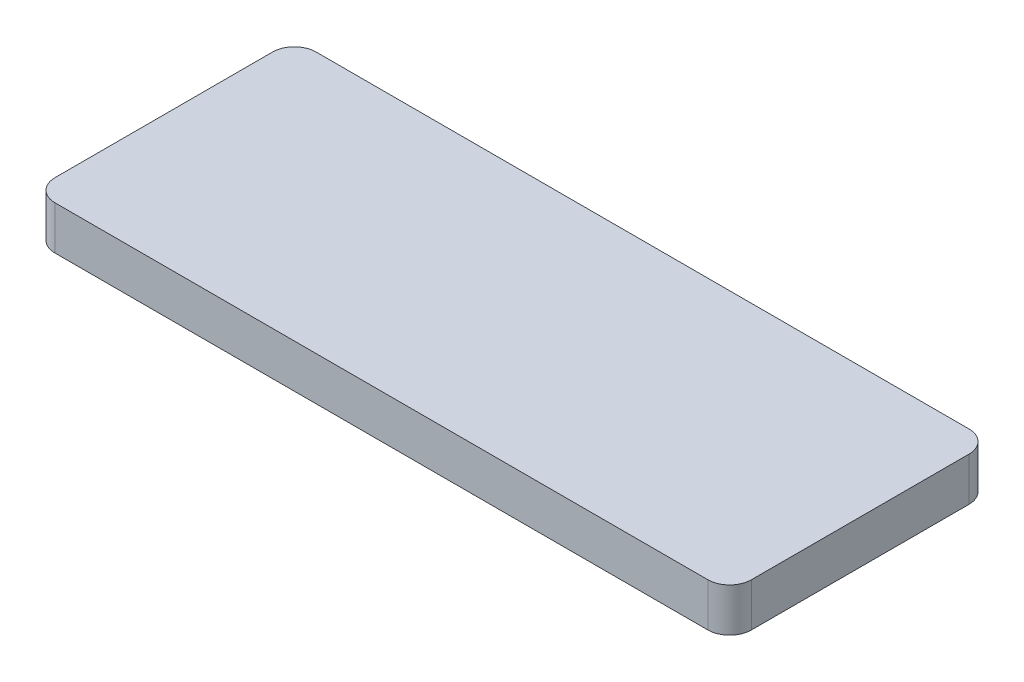
ISO-10303-21;
HEADER;
FILE_DESCRIPTION(('STEP AP214'),'2;1');
FILE_NAME('part.step','',(''),(''),'','','');
FILE_SCHEMA(('AUTOMOTIVE_DESIGN { 1 0 10303 214 1 1 1 1 }'));
ENDSEC;
DATA;
#1=APPLICATION_CONTEXT('core data for automotive mechanical design processes');
#2=APPLICATION_PROTOCOL_DEFINITION('international standard','automotive_design',2000,#1);
#3=PRODUCT_CONTEXT('',#1,'mechanical');
#4=PRODUCT('Part','Part','',(#3));
#5=PRODUCT_RELATED_PRODUCT_CATEGORY('part','',(#4));
#6=PRODUCT_DEFINITION_FORMATION('','',#4);
#7=PRODUCT_DEFINITION_CONTEXT('part definition',#1,'design');
#8=PRODUCT_DEFINITION('design','',#6,#7);
#9=PRODUCT_DEFINITION_SHAPE('','',#8);
#10=(LENGTH_UNIT() NAMED_UNIT(*) SI_UNIT(.MILLI.,.METRE.));
#11=(NAMED_UNIT(*) PLANE_ANGLE_UNIT() SI_UNIT($,.RADIAN.));
#12=(NAMED_UNIT(*) SI_UNIT($,.STERADIAN.) SOLID_ANGLE_UNIT());
#13=UNCERTAINTY_MEASURE_WITH_UNIT(LENGTH_MEASURE(1.E-05),#10,'distance_accuracy_value','');
#14=(GEOMETRIC_REPRESENTATION_CONTEXT(3) GLOBAL_UNCERTAINTY_ASSIGNED_CONTEXT((#13)) GLOBAL_UNIT_ASSIGNED_CONTEXT((#10,
#11,#12)) REPRESENTATION_CONTEXT('',''));
#15=CARTESIAN_POINT('',(0.,0.,0.));
#16=DIRECTION('',(0.,0.,1.));
#17=DIRECTION('',(1.,0.,0.));
#18=AXIS2_PLACEMENT_3D('',#15,#16,#17);
#19=CARTESIAN_POINT('',(80.,10.,30.));
#20=DIRECTION('',(-1.,0.,0.));
#21=DIRECTION('',(0.,0.,1.));
#22=AXIS2_PLACEMENT_3D('',#19,#20,#21);
#23=PLANE('',#22);
#24=DIRECTION('',(0.,0.,-1.));
#25=VECTOR('',#24,1.);
#26=CARTESIAN_POINT('',(80.,0.,30.));
#27=LINE('',#26,#25);
#28=CARTESIAN_POINT('',(80.,0.,25.));
#29=VERTEX_POINT('',#28);
#30=CARTESIAN_POINT('',(80.,0.,-25.));
#31=VERTEX_POINT('',#30);
#32=EDGE_CURVE('E130',#29,#31,#27,.T.);
#33=ORIENTED_EDGE('',*,*,#32,.T.);
#34=DIRECTION('',(0.,-1.,0.));
#35=VECTOR('',#34,1.);
#36=CARTESIAN_POINT('',(80.,10.,-25.));
#37=LINE('',#36,#35);
#38=CARTESIAN_POINT('',(80.,10.,-25.));
#39=VERTEX_POINT('',#38);
#40=EDGE_CURVE('E108',#31,#39,#37,.F.);
#41=ORIENTED_EDGE('',*,*,#40,.T.);
#42=DIRECTION('',(0.,0.,-1.));
#43=VECTOR('',#42,1.);
#44=CARTESIAN_POINT('',(80.,10.,30.));
#45=LINE('',#44,#43);
#46=CARTESIAN_POINT('',(80.,10.,25.));
#47=VERTEX_POINT('',#46);
#48=EDGE_CURVE('E139',#47,#39,#45,.T.);
#49=ORIENTED_EDGE('',*,*,#48,.F.);
#50=DIRECTION('',(0.,-1.,0.));
#51=VECTOR('',#50,1.);
#52=CARTESIAN_POINT('',(80.,10.,25.));
#53=LINE('',#52,#51);
#54=EDGE_CURVE('E113',#47,#29,#53,.T.);
#55=ORIENTED_EDGE('',*,*,#54,.T.);
#56=EDGE_LOOP('',(#33,#41,#49,#55));
#57=FACE_BOUND('',#56,.T.);
#58=ADVANCED_FACE('F37',(#57),#23,.F.);
#59=CARTESIAN_POINT('',(-80.,10.,-30.));
#60=DIRECTION('',(0.,0.,1.));
#61=DIRECTION('',(1.,0.,0.));
#62=AXIS2_PLACEMENT_3D('',#59,#60,#61);
#63=PLANE('',#62);
#64=DIRECTION('',(-1.,0.,0.));
#65=VECTOR('',#64,1.);
#66=CARTESIAN_POINT('',(-80.,10.,-30.));
#67=LINE('',#66,#65);
#68=CARTESIAN_POINT('',(75.,10.,-30.));
#69=VERTEX_POINT('',#68);
#70=CARTESIAN_POINT('',(-75.,10.,-30.));
#71=VERTEX_POINT('',#70);
#72=EDGE_CURVE('E123',#69,#71,#67,.T.);
#73=ORIENTED_EDGE('',*,*,#72,.F.);
#74=DIRECTION('',(0.,-1.,0.));
#75=VECTOR('',#74,1.);
#76=CARTESIAN_POINT('',(75.,10.,-30.));
#77=LINE('',#76,#75);
#78=CARTESIAN_POINT('',(75.,0.,-30.));
#79=VERTEX_POINT('',#78);
#80=EDGE_CURVE('E107',#69,#79,#77,.T.);
#81=ORIENTED_EDGE('',*,*,#80,.T.);
#82=DIRECTION('',(-1.,0.,0.));
#83=VECTOR('',#82,1.);
#84=CARTESIAN_POINT('',(-80.,0.,-30.));
#85=LINE('',#84,#83);
#86=CARTESIAN_POINT('',(-75.,0.,-30.));
#87=VERTEX_POINT('',#86);
#88=EDGE_CURVE('E120',#79,#87,#85,.T.);
#89=ORIENTED_EDGE('',*,*,#88,.T.);
#90=DIRECTION('',(0.,-1.,0.));
#91=VECTOR('',#90,1.);
#92=CARTESIAN_POINT('',(-75.,10.,-30.));
#93=LINE('',#92,#91);
#94=EDGE_CURVE('E125',#87,#71,#93,.F.);
#95=ORIENTED_EDGE('',*,*,#94,.T.);
#96=EDGE_LOOP('',(#73,#81,#89,#95));
#97=FACE_BOUND('',#96,.T.);
#98=ADVANCED_FACE('F119',(#97),#63,.F.);
#99=CARTESIAN_POINT('',(-80.,10.,30.));
#100=DIRECTION('',(1.,0.,0.));
#101=DIRECTION('',(0.,0.,-1.));
#102=AXIS2_PLACEMENT_3D('',#99,#100,#101);
#103=PLANE('',#102);
#104=DIRECTION('',(0.,0.,1.));
#105=VECTOR('',#104,1.);
#106=CARTESIAN_POINT('',(-80.,0.,30.));
#107=LINE('',#106,#105);
#108=CARTESIAN_POINT('',(-80.,0.,-25.));
#109=VERTEX_POINT('',#108);
#110=CARTESIAN_POINT('',(-80.,0.,25.));
#111=VERTEX_POINT('',#110);
#112=EDGE_CURVE('E129',#109,#111,#107,.T.);
#113=ORIENTED_EDGE('',*,*,#112,.T.);
#114=DIRECTION('',(0.,-1.,0.));
#115=VECTOR('',#114,1.);
#116=CARTESIAN_POINT('',(-80.,10.,25.));
#117=LINE('',#116,#115);
#118=CARTESIAN_POINT('',(-80.,10.,25.));
#119=VERTEX_POINT('',#118);
#120=EDGE_CURVE('E11',#111,#119,#117,.F.);
#121=ORIENTED_EDGE('',*,*,#120,.T.);
#122=DIRECTION('',(0.,0.,1.));
#123=VECTOR('',#122,1.);
#124=CARTESIAN_POINT('',(-80.,10.,30.));
#125=LINE('',#124,#123);
#126=CARTESIAN_POINT('',(-80.,10.,-25.));
#127=VERTEX_POINT('',#126);
#128=EDGE_CURVE('E165',#127,#119,#125,.T.);
#129=ORIENTED_EDGE('',*,*,#128,.F.);
#130=DIRECTION('',(0.,-1.,0.));
#131=VECTOR('',#130,1.);
#132=CARTESIAN_POINT('',(-80.,10.,-25.));
#133=LINE('',#132,#131);
#134=EDGE_CURVE('E45',#127,#109,#133,.T.);
#135=ORIENTED_EDGE('',*,*,#134,.T.);
#136=EDGE_LOOP('',(#113,#121,#129,#135));
#137=FACE_BOUND('',#136,.T.);
#138=ADVANCED_FACE('F163',(#137),#103,.F.);
#139=CARTESIAN_POINT('',(-80.,10.,30.));
#140=DIRECTION('',(0.,0.,-1.));
#141=DIRECTION('',(-1.,0.,0.));
#142=AXIS2_PLACEMENT_3D('',#139,#140,#141);
#143=PLANE('',#142);
#144=DIRECTION('',(1.,0.,0.));
#145=VECTOR('',#144,1.);
#146=CARTESIAN_POINT('',(-80.,0.,30.));
#147=LINE('',#146,#145);
#148=CARTESIAN_POINT('',(-75.,0.,30.));
#149=VERTEX_POINT('',#148);
#150=CARTESIAN_POINT('',(75.,0.,30.));
#151=VERTEX_POINT('',#150);
#152=EDGE_CURVE('E133',#149,#151,#147,.T.);
#153=ORIENTED_EDGE('',*,*,#152,.T.);
#154=DIRECTION('',(0.,-1.,0.));
#155=VECTOR('',#154,1.);
#156=CARTESIAN_POINT('',(75.,10.,30.));
#157=LINE('',#156,#155);
#158=CARTESIAN_POINT('',(75.,10.,30.));
#159=VERTEX_POINT('',#158);
#160=EDGE_CURVE('E52',#151,#159,#157,.F.);
#161=ORIENTED_EDGE('',*,*,#160,.T.);
#162=DIRECTION('',(1.,0.,0.));
#163=VECTOR('',#162,1.);
#164=CARTESIAN_POINT('',(-80.,10.,30.));
#165=LINE('',#164,#163);
#166=CARTESIAN_POINT('',(-75.,10.,30.));
#167=VERTEX_POINT('',#166);
#168=EDGE_CURVE('E140',#167,#159,#165,.T.);
#169=ORIENTED_EDGE('',*,*,#168,.F.);
#170=DIRECTION('',(0.,-1.,0.));
#171=VECTOR('',#170,1.);
#172=CARTESIAN_POINT('',(-75.,10.,30.));
#173=LINE('',#172,#171);
#174=EDGE_CURVE('E156',#167,#149,#173,.T.);
#175=ORIENTED_EDGE('',*,*,#174,.T.);
#176=EDGE_LOOP('',(#153,#161,#169,#175));
#177=FACE_BOUND('',#176,.T.);
#178=ADVANCED_FACE('F172',(#177),#143,.F.);
#179=CARTESIAN_POINT('',(0.,10.,0.));
#180=DIRECTION('',(0.,-1.,0.));
#181=DIRECTION('',(0.,0.,-1.));
#182=AXIS2_PLACEMENT_3D('',#179,#180,#181);
#183=PLANE('',#182);
#184=ORIENTED_EDGE('',*,*,#48,.T.);
#185=CARTESIAN_POINT('',(75.,10.,-25.));
#186=DIRECTION('',(0.,-1.,0.));
#187=DIRECTION('',(0.,0.,-1.));
#188=AXIS2_PLACEMENT_3D('',#185,#186,#187);
#189=CIRCLE('',#188,5.);
#190=EDGE_CURVE('E154',#39,#69,#189,.F.);
#191=ORIENTED_EDGE('',*,*,#190,.T.);
#192=ORIENTED_EDGE('',*,*,#72,.T.);
#193=CARTESIAN_POINT('',(-75.,10.,-25.));
#194=DIRECTION('',(0.,-1.,0.));
#195=DIRECTION('',(0.,0.,-1.));
#196=AXIS2_PLACEMENT_3D('',#193,#194,#195);
#197=CIRCLE('',#196,5.);
#198=EDGE_CURVE('E149',#71,#127,#197,.F.);
#199=ORIENTED_EDGE('',*,*,#198,.T.);
#200=ORIENTED_EDGE('',*,*,#128,.T.);
#201=CARTESIAN_POINT('',(-75.,10.,25.));
#202=DIRECTION('',(0.,-1.,0.));
#203=DIRECTION('',(0.,0.,-1.));
#204=AXIS2_PLACEMENT_3D('',#201,#202,#203);
#205=CIRCLE('',#204,5.);
#206=EDGE_CURVE('E59',#119,#167,#205,.F.);
#207=ORIENTED_EDGE('',*,*,#206,.T.);
#208=ORIENTED_EDGE('',*,*,#168,.T.);
#209=CARTESIAN_POINT('',(75.,10.,25.));
#210=DIRECTION('',(0.,-1.,0.));
#211=DIRECTION('',(0.,0.,-1.));
#212=AXIS2_PLACEMENT_3D('',#209,#210,#211);
#213=CIRCLE('',#212,5.);
#214=EDGE_CURVE('E152',#159,#47,#213,.F.);
#215=ORIENTED_EDGE('',*,*,#214,.T.);
#216=EDGE_LOOP('',(#184,#191,#192,#199,#200,#207,#208,#215));
#217=FACE_BOUND('',#216,.T.);
#218=ADVANCED_FACE('F179',(#217),#183,.F.);
#219=CARTESIAN_POINT('',(0.,0.,0.));
#220=DIRECTION('',(0.,-1.,0.));
#221=DIRECTION('',(0.,0.,-1.));
#222=AXIS2_PLACEMENT_3D('',#219,#220,#221);
#223=PLANE('',#222);
#224=ORIENTED_EDGE('',*,*,#88,.F.);
#225=CARTESIAN_POINT('',(75.,0.,-25.));
#226=DIRECTION('',(0.,-1.,0.));
#227=DIRECTION('',(0.,0.,-1.));
#228=AXIS2_PLACEMENT_3D('',#225,#226,#227);
#229=CIRCLE('',#228,5.);
#230=EDGE_CURVE('E103',#79,#31,#229,.T.);
#231=ORIENTED_EDGE('',*,*,#230,.T.);
#232=ORIENTED_EDGE('',*,*,#32,.F.);
#233=CARTESIAN_POINT('',(75.,0.,25.));
#234=DIRECTION('',(0.,-1.,0.));
#235=DIRECTION('',(0.,0.,-1.));
#236=AXIS2_PLACEMENT_3D('',#233,#234,#235);
#237=CIRCLE('',#236,5.);
#238=EDGE_CURVE('E114',#29,#151,#237,.T.);
#239=ORIENTED_EDGE('',*,*,#238,.T.);
#240=ORIENTED_EDGE('',*,*,#152,.F.);
#241=CARTESIAN_POINT('',(-75.,0.,25.));
#242=DIRECTION('',(0.,-1.,0.));
#243=DIRECTION('',(0.,0.,-1.));
#244=AXIS2_PLACEMENT_3D('',#241,#242,#243);
#245=CIRCLE('',#244,5.);
#246=EDGE_CURVE('E143',#149,#111,#245,.T.);
#247=ORIENTED_EDGE('',*,*,#246,.T.);
#248=ORIENTED_EDGE('',*,*,#112,.F.);
#249=CARTESIAN_POINT('',(-75.,0.,-25.));
#250=DIRECTION('',(0.,-1.,0.));
#251=DIRECTION('',(0.,0.,-1.));
#252=AXIS2_PLACEMENT_3D('',#249,#250,#251);
#253=CIRCLE('',#252,5.);
#254=EDGE_CURVE('E124',#109,#87,#253,.T.);
#255=ORIENTED_EDGE('',*,*,#254,.T.);
#256=EDGE_LOOP('',(#224,#231,#232,#239,#240,#247,#248,#255));
#257=FACE_BOUND('',#256,.T.);
#258=ADVANCED_FACE('F127',(#257),#223,.T.);
#259=CARTESIAN_POINT('',(75.,10.,-25.));
#260=DIRECTION('',(0.,-1.,0.));
#261=DIRECTION('',(0.,0.,-1.));
#262=AXIS2_PLACEMENT_3D('',#259,#260,#261);
#263=CYLINDRICAL_SURFACE('',#262,5.);
#264=ORIENTED_EDGE('',*,*,#190,.F.);
#265=ORIENTED_EDGE('',*,*,#40,.F.);
#266=ORIENTED_EDGE('',*,*,#230,.F.);
#267=ORIENTED_EDGE('',*,*,#80,.F.);
#268=EDGE_LOOP('',(#264,#265,#266,#267));
#269=FACE_BOUND('',#268,.T.);
#270=ADVANCED_FACE('F106',(#269),#263,.T.);
#271=CARTESIAN_POINT('',(75.,10.,25.));
#272=DIRECTION('',(0.,-1.,0.));
#273=DIRECTION('',(0.,0.,-1.));
#274=AXIS2_PLACEMENT_3D('',#271,#272,#273);
#275=CYLINDRICAL_SURFACE('',#274,5.);
#276=ORIENTED_EDGE('',*,*,#214,.F.);
#277=ORIENTED_EDGE('',*,*,#160,.F.);
#278=ORIENTED_EDGE('',*,*,#238,.F.);
#279=ORIENTED_EDGE('',*,*,#54,.F.);
#280=EDGE_LOOP('',(#276,#277,#278,#279));
#281=FACE_BOUND('',#280,.T.);
#282=ADVANCED_FACE('F183',(#281),#275,.T.);
#283=CARTESIAN_POINT('',(-75.,10.,25.));
#284=DIRECTION('',(0.,-1.,0.));
#285=DIRECTION('',(0.,0.,-1.));
#286=AXIS2_PLACEMENT_3D('',#283,#284,#285);
#287=CYLINDRICAL_SURFACE('',#286,5.);
#288=ORIENTED_EDGE('',*,*,#206,.F.);
#289=ORIENTED_EDGE('',*,*,#120,.F.);
#290=ORIENTED_EDGE('',*,*,#246,.F.);
#291=ORIENTED_EDGE('',*,*,#174,.F.);
#292=EDGE_LOOP('',(#288,#289,#290,#291));
#293=FACE_BOUND('',#292,.T.);
#294=ADVANCED_FACE('F171',(#293),#287,.T.);
#295=CARTESIAN_POINT('',(-75.,10.,-25.));
#296=DIRECTION('',(0.,-1.,0.));
#297=DIRECTION('',(0.,0.,-1.));
#298=AXIS2_PLACEMENT_3D('',#295,#296,#297);
#299=CYLINDRICAL_SURFACE('',#298,5.);
#300=ORIENTED_EDGE('',*,*,#198,.F.);
#301=ORIENTED_EDGE('',*,*,#94,.F.);
#302=ORIENTED_EDGE('',*,*,#254,.F.);
#303=ORIENTED_EDGE('',*,*,#134,.F.);
#304=EDGE_LOOP('',(#300,#301,#302,#303));
#305=FACE_BOUND('',#304,.T.);
#306=ADVANCED_FACE('F39',(#305),#299,.T.);
#307=CLOSED_SHELL('',(#58,#98,#138,#178,#218,#258,#270,#282,#294,#306));
#308=MANIFOLD_SOLID_BREP('B2',#307);
#309=ADVANCED_BREP_SHAPE_REPRESENTATION('',(#18,#308),#14);
#310=SHAPE_DEFINITION_REPRESENTATION(#9,#309);
ENDSEC;
END-ISO-10303-21;
